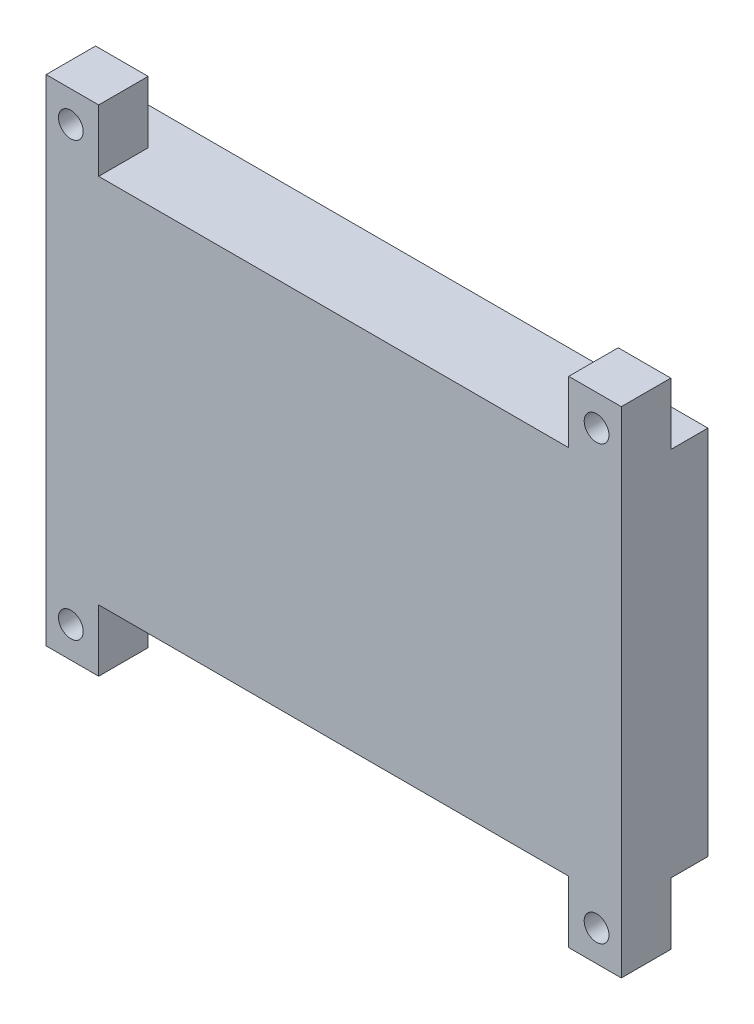
ISO-10303-21;
HEADER;
FILE_DESCRIPTION(('STEP AP214'),'2;1');
FILE_NAME('part.step','',(''),(''),'','','');
FILE_SCHEMA(('AUTOMOTIVE_DESIGN { 1 0 10303 214 1 1 1 1 }'));
ENDSEC;
DATA;
#1=APPLICATION_CONTEXT('core data for automotive mechanical design processes');
#2=APPLICATION_PROTOCOL_DEFINITION('international standard','automotive_design',2000,#1);
#3=PRODUCT_CONTEXT('',#1,'mechanical');
#4=PRODUCT('Part','Part','',(#3));
#5=PRODUCT_RELATED_PRODUCT_CATEGORY('part','',(#4));
#6=PRODUCT_DEFINITION_FORMATION('','',#4);
#7=PRODUCT_DEFINITION_CONTEXT('part definition',#1,'design');
#8=PRODUCT_DEFINITION('design','',#6,#7);
#9=PRODUCT_DEFINITION_SHAPE('','',#8);
#10=(LENGTH_UNIT() NAMED_UNIT(*) SI_UNIT(.MILLI.,.METRE.));
#11=(NAMED_UNIT(*) PLANE_ANGLE_UNIT() SI_UNIT($,.RADIAN.));
#12=(NAMED_UNIT(*) SI_UNIT($,.STERADIAN.) SOLID_ANGLE_UNIT());
#13=UNCERTAINTY_MEASURE_WITH_UNIT(LENGTH_MEASURE(1.E-05),#10,'distance_accuracy_value','');
#14=(GEOMETRIC_REPRESENTATION_CONTEXT(3) GLOBAL_UNCERTAINTY_ASSIGNED_CONTEXT((#13)) GLOBAL_UNIT_ASSIGNED_CONTEXT((#10,
#11,#12)) REPRESENTATION_CONTEXT('',''));
#15=CARTESIAN_POINT('',(0.,0.,0.));
#16=DIRECTION('',(0.,0.,1.));
#17=DIRECTION('',(1.,0.,0.));
#18=AXIS2_PLACEMENT_3D('',#15,#16,#17);
#19=CARTESIAN_POINT('',(0.,0.,6.));
#20=DIRECTION('',(0.,0.,1.));
#21=DIRECTION('',(1.,0.,0.));
#22=AXIS2_PLACEMENT_3D('',#19,#20,#21);
#23=PLANE('',#22);
#24=CARTESIAN_POINT('',(-42.5,35.,6.));
#25=DIRECTION('',(0.,0.,-1.));
#26=DIRECTION('',(1.,0.,0.));
#27=AXIS2_PLACEMENT_3D('',#24,#25,#26);
#28=CIRCLE('',#27,2.);
#29=CARTESIAN_POINT('',(-40.5,35.,6.));
#30=VERTEX_POINT('',#29);
#31=EDGE_CURVE('E343',#30,#30,#28,.T.);
#32=ORIENTED_EDGE('',*,*,#31,.F.);
#33=EDGE_LOOP('',(#32));
#34=FACE_BOUND('',#33,.T.);
#35=DIRECTION('',(-1.,0.,0.));
#36=VECTOR('',#35,1.);
#37=CARTESIAN_POINT('',(-46.5,40.,6.));
#38=LINE('',#37,#36);
#39=CARTESIAN_POINT('',(-38.,40.,6.));
#40=VERTEX_POINT('',#39);
#41=CARTESIAN_POINT('',(-46.5,40.,6.));
#42=VERTEX_POINT('',#41);
#43=EDGE_CURVE('E192',#40,#42,#38,.T.);
#44=ORIENTED_EDGE('',*,*,#43,.F.);
#45=DIRECTION('',(0.,1.,0.));
#46=VECTOR('',#45,1.);
#47=CARTESIAN_POINT('',(-38.,40.,6.));
#48=LINE('',#47,#46);
#49=CARTESIAN_POINT('',(-38.,30.,6.));
#50=VERTEX_POINT('',#49);
#51=EDGE_CURVE('E153',#50,#40,#48,.T.);
#52=ORIENTED_EDGE('',*,*,#51,.F.);
#53=DIRECTION('',(-1.,0.,0.));
#54=VECTOR('',#53,1.);
#55=CARTESIAN_POINT('',(-46.5,30.,6.));
#56=LINE('',#55,#54);
#57=CARTESIAN_POINT('',(-46.5,30.,6.));
#58=VERTEX_POINT('',#57);
#59=EDGE_CURVE('E212',#50,#58,#56,.T.);
#60=ORIENTED_EDGE('',*,*,#59,.T.);
#61=DIRECTION('',(0.,-1.,0.));
#62=VECTOR('',#61,1.);
#63=CARTESIAN_POINT('',(-46.5,40.,6.));
#64=LINE('',#63,#62);
#65=EDGE_CURVE('E180',#42,#58,#64,.T.);
#66=ORIENTED_EDGE('',*,*,#65,.F.);
#67=EDGE_LOOP('',(#44,#52,#60,#66));
#68=FACE_BOUND('',#67,.T.);
#69=ADVANCED_FACE('F35',(#34,#68),#23,.F.);
#70=CARTESIAN_POINT('',(42.5,-35.,6.));
#71=DIRECTION('',(0.,0.,-1.));
#72=DIRECTION('',(1.,0.,0.));
#73=AXIS2_PLACEMENT_3D('',#70,#71,#72);
#74=CIRCLE('',#73,2.);
#75=CARTESIAN_POINT('',(44.5,-35.,6.));
#76=VERTEX_POINT('',#75);
#77=EDGE_CURVE('E346',#76,#76,#74,.T.);
#78=ORIENTED_EDGE('',*,*,#77,.F.);
#79=EDGE_LOOP('',(#78));
#80=FACE_BOUND('',#79,.T.);
#81=DIRECTION('',(1.,0.,0.));
#82=VECTOR('',#81,1.);
#83=CARTESIAN_POINT('',(-46.5,-40.,6.));
#84=LINE('',#83,#82);
#85=CARTESIAN_POINT('',(38.,-40.,6.));
#86=VERTEX_POINT('',#85);
#87=CARTESIAN_POINT('',(46.5,-40.,6.));
#88=VERTEX_POINT('',#87);
#89=EDGE_CURVE('E183',#86,#88,#84,.T.);
#90=ORIENTED_EDGE('',*,*,#89,.F.);
#91=DIRECTION('',(0.,-1.,0.));
#92=VECTOR('',#91,1.);
#93=CARTESIAN_POINT('',(38.,-30.,6.));
#94=LINE('',#93,#92);
#95=CARTESIAN_POINT('',(38.,-30.,6.));
#96=VERTEX_POINT('',#95);
#97=EDGE_CURVE('E253',#96,#86,#94,.T.);
#98=ORIENTED_EDGE('',*,*,#97,.F.);
#99=DIRECTION('',(1.,0.,0.));
#100=VECTOR('',#99,1.);
#101=CARTESIAN_POINT('',(-46.5,-30.,6.));
#102=LINE('',#101,#100);
#103=CARTESIAN_POINT('',(46.5,-30.,6.));
#104=VERTEX_POINT('',#103);
#105=EDGE_CURVE('E211',#96,#104,#102,.T.);
#106=ORIENTED_EDGE('',*,*,#105,.T.);
#107=DIRECTION('',(0.,1.,0.));
#108=VECTOR('',#107,1.);
#109=CARTESIAN_POINT('',(46.5,40.,6.));
#110=LINE('',#109,#108);
#111=EDGE_CURVE('E189',#88,#104,#110,.T.);
#112=ORIENTED_EDGE('',*,*,#111,.F.);
#113=EDGE_LOOP('',(#90,#98,#106,#112));
#114=FACE_BOUND('',#113,.T.);
#115=ADVANCED_FACE('F251',(#80,#114),#23,.F.);
#116=CARTESIAN_POINT('',(-46.5,-40.,14.));
#117=DIRECTION('',(0.,1.,0.));
#118=DIRECTION('',(0.,0.,1.));
#119=AXIS2_PLACEMENT_3D('',#116,#117,#118);
#120=PLANE('',#119);
#121=DIRECTION('',(1.,0.,0.));
#122=VECTOR('',#121,1.);
#123=CARTESIAN_POINT('',(-46.5,-40.,14.));
#124=LINE('',#123,#122);
#125=CARTESIAN_POINT('',(38.,-40.,14.));
#126=VERTEX_POINT('',#125);
#127=CARTESIAN_POINT('',(46.5,-40.,14.));
#128=VERTEX_POINT('',#127);
#129=EDGE_CURVE('E281',#126,#128,#124,.T.);
#130=ORIENTED_EDGE('',*,*,#129,.F.);
#131=DIRECTION('',(0.,0.,-1.));
#132=VECTOR('',#131,1.);
#133=CARTESIAN_POINT('',(38.,-40.,14.));
#134=LINE('',#133,#132);
#135=EDGE_CURVE('E263',#126,#86,#134,.T.);
#136=ORIENTED_EDGE('',*,*,#135,.T.);
#137=ORIENTED_EDGE('',*,*,#89,.T.);
#138=DIRECTION('',(0.,0.,-1.));
#139=VECTOR('',#138,1.);
#140=CARTESIAN_POINT('',(46.5,-40.,14.));
#141=LINE('',#140,#139);
#142=EDGE_CURVE('E201',#128,#88,#141,.T.);
#143=ORIENTED_EDGE('',*,*,#142,.F.);
#144=EDGE_LOOP('',(#130,#136,#137,#143));
#145=FACE_BOUND('',#144,.T.);
#146=ADVANCED_FACE('F284',(#145),#120,.F.);
#147=CARTESIAN_POINT('',(-46.5,40.,14.));
#148=DIRECTION('',(0.,-1.,0.));
#149=DIRECTION('',(0.,0.,-1.));
#150=AXIS2_PLACEMENT_3D('',#147,#148,#149);
#151=PLANE('',#150);
#152=DIRECTION('',(-1.,0.,0.));
#153=VECTOR('',#152,1.);
#154=CARTESIAN_POINT('',(-46.5,40.,14.));
#155=LINE('',#154,#153);
#156=CARTESIAN_POINT('',(-38.,40.,14.));
#157=VERTEX_POINT('',#156);
#158=CARTESIAN_POINT('',(-46.5,40.,14.));
#159=VERTEX_POINT('',#158);
#160=EDGE_CURVE('E162',#157,#159,#155,.T.);
#161=ORIENTED_EDGE('',*,*,#160,.F.);
#162=DIRECTION('',(0.,0.,-1.));
#163=VECTOR('',#162,1.);
#164=CARTESIAN_POINT('',(-38.,40.,14.));
#165=LINE('',#164,#163);
#166=EDGE_CURVE('E148',#157,#40,#165,.T.);
#167=ORIENTED_EDGE('',*,*,#166,.T.);
#168=ORIENTED_EDGE('',*,*,#43,.T.);
#169=DIRECTION('',(0.,0.,-1.));
#170=VECTOR('',#169,1.);
#171=CARTESIAN_POINT('',(-46.5,40.,14.));
#172=LINE('',#171,#170);
#173=EDGE_CURVE('E170',#159,#42,#172,.T.);
#174=ORIENTED_EDGE('',*,*,#173,.F.);
#175=EDGE_LOOP('',(#161,#167,#168,#174));
#176=FACE_BOUND('',#175,.T.);
#177=ADVANCED_FACE('F168',(#176),#151,.F.);
#178=CARTESIAN_POINT('',(46.5,30.,6.));
#179=DIRECTION('',(-1.,0.,0.));
#180=DIRECTION('',(0.,-1.,0.));
#181=AXIS2_PLACEMENT_3D('',#178,#179,#180);
#182=PLANE('',#181);
#183=DIRECTION('',(0.,1.,0.));
#184=VECTOR('',#183,1.);
#185=CARTESIAN_POINT('',(46.5,30.,0.));
#186=LINE('',#185,#184);
#187=CARTESIAN_POINT('',(46.5,-30.,0.));
#188=VERTEX_POINT('',#187);
#189=CARTESIAN_POINT('',(46.5,30.,0.));
#190=VERTEX_POINT('',#189);
#191=EDGE_CURVE('E207',#188,#190,#186,.T.);
#192=ORIENTED_EDGE('',*,*,#191,.T.);
#193=DIRECTION('',(0.,0.,-1.));
#194=VECTOR('',#193,1.);
#195=CARTESIAN_POINT('',(46.5,30.,6.));
#196=LINE('',#195,#194);
#197=CARTESIAN_POINT('',(46.5,30.,6.));
#198=VERTEX_POINT('',#197);
#199=EDGE_CURVE('E11',#198,#190,#196,.T.);
#200=ORIENTED_EDGE('',*,*,#199,.F.);
#201=CARTESIAN_POINT('',(46.5,40.,6.));
#202=VERTEX_POINT('',#201);
#203=EDGE_CURVE('E188',#198,#202,#110,.T.);
#204=ORIENTED_EDGE('',*,*,#203,.T.);
#205=DIRECTION('',(0.,0.,-1.));
#206=VECTOR('',#205,1.);
#207=CARTESIAN_POINT('',(46.5,40.,14.));
#208=LINE('',#207,#206);
#209=CARTESIAN_POINT('',(46.5,40.,14.));
#210=VERTEX_POINT('',#209);
#211=EDGE_CURVE('E198',#210,#202,#208,.T.);
#212=ORIENTED_EDGE('',*,*,#211,.F.);
#213=DIRECTION('',(0.,1.,0.));
#214=VECTOR('',#213,1.);
#215=CARTESIAN_POINT('',(46.5,40.,14.));
#216=LINE('',#215,#214);
#217=EDGE_CURVE('E173',#128,#210,#216,.T.);
#218=ORIENTED_EDGE('',*,*,#217,.F.);
#219=ORIENTED_EDGE('',*,*,#142,.T.);
#220=ORIENTED_EDGE('',*,*,#111,.T.);
#221=DIRECTION('',(0.,0.,-1.));
#222=VECTOR('',#221,1.);
#223=CARTESIAN_POINT('',(46.5,-30.,6.));
#224=LINE('',#223,#222);
#225=EDGE_CURVE('E216',#104,#188,#224,.T.);
#226=ORIENTED_EDGE('',*,*,#225,.T.);
#227=EDGE_LOOP('',(#192,#200,#204,#212,#218,#219,#220,#226));
#228=FACE_BOUND('',#227,.T.);
#229=ADVANCED_FACE('F37',(#228),#182,.F.);
#230=CARTESIAN_POINT('',(-46.5,30.,6.));
#231=DIRECTION('',(0.,-1.,0.));
#232=DIRECTION('',(0.,0.,-1.));
#233=AXIS2_PLACEMENT_3D('',#230,#231,#232);
#234=PLANE('',#233);
#235=DIRECTION('',(-1.,0.,0.));
#236=VECTOR('',#235,1.);
#237=CARTESIAN_POINT('',(-46.5,30.,0.));
#238=LINE('',#237,#236);
#239=CARTESIAN_POINT('',(-46.5,30.,0.));
#240=VERTEX_POINT('',#239);
#241=EDGE_CURVE('E219',#190,#240,#238,.T.);
#242=ORIENTED_EDGE('',*,*,#241,.T.);
#243=DIRECTION('',(0.,0.,-1.));
#244=VECTOR('',#243,1.);
#245=CARTESIAN_POINT('',(-46.5,30.,6.));
#246=LINE('',#245,#244);
#247=EDGE_CURVE('E43',#58,#240,#246,.T.);
#248=ORIENTED_EDGE('',*,*,#247,.F.);
#249=ORIENTED_EDGE('',*,*,#59,.F.);
#250=DIRECTION('',(0.,0.,-1.));
#251=VECTOR('',#250,1.);
#252=CARTESIAN_POINT('',(-38.,30.,14.));
#253=LINE('',#252,#251);
#254=CARTESIAN_POINT('',(-38.,30.,14.));
#255=VERTEX_POINT('',#254);
#256=EDGE_CURVE('E299',#255,#50,#253,.T.);
#257=ORIENTED_EDGE('',*,*,#256,.F.);
#258=DIRECTION('',(-1.,0.,0.));
#259=VECTOR('',#258,1.);
#260=CARTESIAN_POINT('',(-38.,30.,14.));
#261=LINE('',#260,#259);
#262=CARTESIAN_POINT('',(38.,30.,14.));
#263=VERTEX_POINT('',#262);
#264=EDGE_CURVE('E50',#263,#255,#261,.T.);
#265=ORIENTED_EDGE('',*,*,#264,.F.);
#266=DIRECTION('',(0.,0.,-1.));
#267=VECTOR('',#266,1.);
#268=CARTESIAN_POINT('',(38.,30.,14.));
#269=LINE('',#268,#267);
#270=CARTESIAN_POINT('',(38.,30.,6.));
#271=VERTEX_POINT('',#270);
#272=EDGE_CURVE('E301',#263,#271,#269,.T.);
#273=ORIENTED_EDGE('',*,*,#272,.T.);
#274=EDGE_CURVE('E208',#198,#271,#56,.T.);
#275=ORIENTED_EDGE('',*,*,#274,.F.);
#276=ORIENTED_EDGE('',*,*,#199,.T.);
#277=EDGE_LOOP('',(#242,#248,#249,#257,#265,#273,#275,#276));
#278=FACE_BOUND('',#277,.T.);
#279=ADVANCED_FACE('F307',(#278),#234,.F.);
#280=CARTESIAN_POINT('',(-46.5,30.,6.));
#281=DIRECTION('',(1.,0.,0.));
#282=DIRECTION('',(0.,1.,0.));
#283=AXIS2_PLACEMENT_3D('',#280,#281,#282);
#284=PLANE('',#283);
#285=DIRECTION('',(0.,-1.,0.));
#286=VECTOR('',#285,1.);
#287=CARTESIAN_POINT('',(-46.5,30.,0.));
#288=LINE('',#287,#286);
#289=CARTESIAN_POINT('',(-46.5,-30.,0.));
#290=VERTEX_POINT('',#289);
#291=EDGE_CURVE('E221',#240,#290,#288,.T.);
#292=ORIENTED_EDGE('',*,*,#291,.T.);
#293=DIRECTION('',(0.,0.,-1.));
#294=VECTOR('',#293,1.);
#295=CARTESIAN_POINT('',(-46.5,-30.,6.));
#296=LINE('',#295,#294);
#297=CARTESIAN_POINT('',(-46.5,-30.,6.));
#298=VERTEX_POINT('',#297);
#299=EDGE_CURVE('E227',#298,#290,#296,.T.);
#300=ORIENTED_EDGE('',*,*,#299,.F.);
#301=CARTESIAN_POINT('',(-46.5,-40.,6.));
#302=VERTEX_POINT('',#301);
#303=EDGE_CURVE('E184',#298,#302,#64,.T.);
#304=ORIENTED_EDGE('',*,*,#303,.T.);
#305=DIRECTION('',(0.,0.,-1.));
#306=VECTOR('',#305,1.);
#307=CARTESIAN_POINT('',(-46.5,-40.,14.));
#308=LINE('',#307,#306);
#309=CARTESIAN_POINT('',(-46.5,-40.,14.));
#310=VERTEX_POINT('',#309);
#311=EDGE_CURVE('E204',#310,#302,#308,.T.);
#312=ORIENTED_EDGE('',*,*,#311,.F.);
#313=DIRECTION('',(0.,-1.,0.));
#314=VECTOR('',#313,1.);
#315=CARTESIAN_POINT('',(-46.5,40.,14.));
#316=LINE('',#315,#314);
#317=EDGE_CURVE('E196',#159,#310,#316,.T.);
#318=ORIENTED_EDGE('',*,*,#317,.F.);
#319=ORIENTED_EDGE('',*,*,#173,.T.);
#320=ORIENTED_EDGE('',*,*,#65,.T.);
#321=ORIENTED_EDGE('',*,*,#247,.T.);
#322=EDGE_LOOP('',(#292,#300,#304,#312,#318,#319,#320,#321));
#323=FACE_BOUND('',#322,.T.);
#324=ADVANCED_FACE('F233',(#323),#284,.F.);
#325=CARTESIAN_POINT('',(-46.5,-30.,6.));
#326=DIRECTION('',(0.,1.,0.));
#327=DIRECTION('',(0.,0.,1.));
#328=AXIS2_PLACEMENT_3D('',#325,#326,#327);
#329=PLANE('',#328);
#330=DIRECTION('',(1.,0.,0.));
#331=VECTOR('',#330,1.);
#332=CARTESIAN_POINT('',(-46.5,-30.,0.));
#333=LINE('',#332,#331);
#334=EDGE_CURVE('E223',#290,#188,#333,.T.);
#335=ORIENTED_EDGE('',*,*,#334,.T.);
#336=ORIENTED_EDGE('',*,*,#225,.F.);
#337=ORIENTED_EDGE('',*,*,#105,.F.);
#338=DIRECTION('',(0.,0.,-1.));
#339=VECTOR('',#338,1.);
#340=CARTESIAN_POINT('',(38.,-30.,14.));
#341=LINE('',#340,#339);
#342=CARTESIAN_POINT('',(38.,-30.,14.));
#343=VERTEX_POINT('',#342);
#344=EDGE_CURVE('E254',#343,#96,#341,.T.);
#345=ORIENTED_EDGE('',*,*,#344,.F.);
#346=DIRECTION('',(1.,0.,0.));
#347=VECTOR('',#346,1.);
#348=CARTESIAN_POINT('',(38.,-30.,14.));
#349=LINE('',#348,#347);
#350=CARTESIAN_POINT('',(-38.,-30.,14.));
#351=VERTEX_POINT('',#350);
#352=EDGE_CURVE('E58',#351,#343,#349,.T.);
#353=ORIENTED_EDGE('',*,*,#352,.F.);
#354=DIRECTION('',(0.,0.,-1.));
#355=VECTOR('',#354,1.);
#356=CARTESIAN_POINT('',(-38.,-30.,14.));
#357=LINE('',#356,#355);
#358=CARTESIAN_POINT('',(-38.,-30.,6.));
#359=VERTEX_POINT('',#358);
#360=EDGE_CURVE('E257',#351,#359,#357,.T.);
#361=ORIENTED_EDGE('',*,*,#360,.T.);
#362=EDGE_CURVE('E213',#298,#359,#102,.T.);
#363=ORIENTED_EDGE('',*,*,#362,.F.);
#364=ORIENTED_EDGE('',*,*,#299,.T.);
#365=EDGE_LOOP('',(#335,#336,#337,#345,#353,#361,#363,#364));
#366=FACE_BOUND('',#365,.T.);
#367=ADVANCED_FACE('F241',(#366),#329,.F.);
#368=CARTESIAN_POINT('',(0.,0.,0.));
#369=DIRECTION('',(0.,0.,1.));
#370=DIRECTION('',(1.,0.,0.));
#371=AXIS2_PLACEMENT_3D('',#368,#369,#370);
#372=PLANE('',#371);
#373=ORIENTED_EDGE('',*,*,#191,.F.);
#374=ORIENTED_EDGE('',*,*,#334,.F.);
#375=ORIENTED_EDGE('',*,*,#291,.F.);
#376=ORIENTED_EDGE('',*,*,#241,.F.);
#377=EDGE_LOOP('',(#373,#374,#375,#376));
#378=FACE_BOUND('',#377,.T.);
#379=ADVANCED_FACE('F239',(#378),#372,.F.);
#380=CARTESIAN_POINT('',(42.5,35.,6.));
#381=DIRECTION('',(0.,0.,-1.));
#382=DIRECTION('',(-1.,0.,0.));
#383=AXIS2_PLACEMENT_3D('',#380,#381,#382);
#384=CIRCLE('',#383,2.);
#385=CARTESIAN_POINT('',(40.5,35.,6.));
#386=VERTEX_POINT('',#385);
#387=EDGE_CURVE('E337',#386,#386,#384,.T.);
#388=ORIENTED_EDGE('',*,*,#387,.F.);
#389=EDGE_LOOP('',(#388));
#390=FACE_BOUND('',#389,.T.);
#391=ORIENTED_EDGE('',*,*,#274,.T.);
#392=DIRECTION('',(0.,-1.,0.));
#393=VECTOR('',#392,1.);
#394=CARTESIAN_POINT('',(38.,40.,6.));
#395=LINE('',#394,#393);
#396=CARTESIAN_POINT('',(38.,40.,6.));
#397=VERTEX_POINT('',#396);
#398=EDGE_CURVE('E166',#397,#271,#395,.T.);
#399=ORIENTED_EDGE('',*,*,#398,.F.);
#400=EDGE_CURVE('E193',#202,#397,#38,.T.);
#401=ORIENTED_EDGE('',*,*,#400,.F.);
#402=ORIENTED_EDGE('',*,*,#203,.F.);
#403=EDGE_LOOP('',(#391,#399,#401,#402));
#404=FACE_BOUND('',#403,.T.);
#405=ADVANCED_FACE('F306',(#390,#404),#23,.F.);
#406=CARTESIAN_POINT('',(-42.5,-35.,6.));
#407=DIRECTION('',(0.,0.,-1.));
#408=DIRECTION('',(-1.,0.,0.));
#409=AXIS2_PLACEMENT_3D('',#406,#407,#408);
#410=CIRCLE('',#409,2.);
#411=CARTESIAN_POINT('',(-44.5,-35.,6.));
#412=VERTEX_POINT('',#411);
#413=EDGE_CURVE('E352',#412,#412,#410,.T.);
#414=ORIENTED_EDGE('',*,*,#413,.F.);
#415=EDGE_LOOP('',(#414));
#416=FACE_BOUND('',#415,.T.);
#417=ORIENTED_EDGE('',*,*,#362,.T.);
#418=DIRECTION('',(0.,1.,0.));
#419=VECTOR('',#418,1.);
#420=CARTESIAN_POINT('',(-38.,-30.,6.));
#421=LINE('',#420,#419);
#422=CARTESIAN_POINT('',(-38.,-40.,6.));
#423=VERTEX_POINT('',#422);
#424=EDGE_CURVE('E266',#423,#359,#421,.T.);
#425=ORIENTED_EDGE('',*,*,#424,.F.);
#426=EDGE_CURVE('E185',#302,#423,#84,.T.);
#427=ORIENTED_EDGE('',*,*,#426,.F.);
#428=ORIENTED_EDGE('',*,*,#303,.F.);
#429=EDGE_LOOP('',(#417,#425,#427,#428));
#430=FACE_BOUND('',#429,.T.);
#431=ADVANCED_FACE('F321',(#416,#430),#23,.F.);
#432=ORIENTED_EDGE('',*,*,#426,.T.);
#433=DIRECTION('',(0.,0.,-1.));
#434=VECTOR('',#433,1.);
#435=CARTESIAN_POINT('',(-38.,-40.,14.));
#436=LINE('',#435,#434);
#437=CARTESIAN_POINT('',(-38.,-40.,14.));
#438=VERTEX_POINT('',#437);
#439=EDGE_CURVE('E271',#438,#423,#436,.T.);
#440=ORIENTED_EDGE('',*,*,#439,.F.);
#441=EDGE_CURVE('E176',#310,#438,#124,.T.);
#442=ORIENTED_EDGE('',*,*,#441,.F.);
#443=ORIENTED_EDGE('',*,*,#311,.T.);
#444=EDGE_LOOP('',(#432,#440,#442,#443));
#445=FACE_BOUND('',#444,.T.);
#446=ADVANCED_FACE('F332',(#445),#120,.F.);
#447=ORIENTED_EDGE('',*,*,#400,.T.);
#448=DIRECTION('',(0.,0.,-1.));
#449=VECTOR('',#448,1.);
#450=CARTESIAN_POINT('',(38.,40.,14.));
#451=LINE('',#450,#449);
#452=CARTESIAN_POINT('',(38.,40.,14.));
#453=VERTEX_POINT('',#452);
#454=EDGE_CURVE('E157',#453,#397,#451,.T.);
#455=ORIENTED_EDGE('',*,*,#454,.F.);
#456=EDGE_CURVE('E172',#210,#453,#155,.T.);
#457=ORIENTED_EDGE('',*,*,#456,.F.);
#458=ORIENTED_EDGE('',*,*,#211,.T.);
#459=EDGE_LOOP('',(#447,#455,#457,#458));
#460=FACE_BOUND('',#459,.T.);
#461=ADVANCED_FACE('F290',(#460),#151,.F.);
#462=CARTESIAN_POINT('',(0.,0.,14.));
#463=DIRECTION('',(0.,0.,1.));
#464=DIRECTION('',(1.,0.,0.));
#465=AXIS2_PLACEMENT_3D('',#462,#463,#464);
#466=PLANE('',#465);
#467=CARTESIAN_POINT('',(42.5,-35.,14.));
#468=DIRECTION('',(0.,0.,-1.));
#469=DIRECTION('',(1.,0.,0.));
#470=AXIS2_PLACEMENT_3D('',#467,#468,#469);
#471=CIRCLE('',#470,2.);
#472=CARTESIAN_POINT('',(44.5,-35.,14.));
#473=VERTEX_POINT('',#472);
#474=EDGE_CURVE('E349',#473,#473,#471,.T.);
#475=ORIENTED_EDGE('',*,*,#474,.T.);
#476=EDGE_LOOP('',(#475));
#477=FACE_BOUND('',#476,.T.);
#478=CARTESIAN_POINT('',(-42.5,-35.,14.));
#479=DIRECTION('',(0.,0.,-1.));
#480=DIRECTION('',(-1.,0.,0.));
#481=AXIS2_PLACEMENT_3D('',#478,#479,#480);
#482=CIRCLE('',#481,2.);
#483=CARTESIAN_POINT('',(-44.5,-35.,14.));
#484=VERTEX_POINT('',#483);
#485=EDGE_CURVE('E355',#484,#484,#482,.T.);
#486=ORIENTED_EDGE('',*,*,#485,.T.);
#487=EDGE_LOOP('',(#486));
#488=FACE_BOUND('',#487,.T.);
#489=CARTESIAN_POINT('',(-42.5,35.,14.));
#490=DIRECTION('',(0.,0.,-1.));
#491=DIRECTION('',(1.,0.,0.));
#492=AXIS2_PLACEMENT_3D('',#489,#490,#491);
#493=CIRCLE('',#492,2.);
#494=CARTESIAN_POINT('',(-40.5,35.,14.));
#495=VERTEX_POINT('',#494);
#496=EDGE_CURVE('E339',#495,#495,#493,.T.);
#497=ORIENTED_EDGE('',*,*,#496,.T.);
#498=EDGE_LOOP('',(#497));
#499=FACE_BOUND('',#498,.T.);
#500=CARTESIAN_POINT('',(42.5,35.,14.));
#501=DIRECTION('',(0.,0.,-1.));
#502=DIRECTION('',(-1.,0.,0.));
#503=AXIS2_PLACEMENT_3D('',#500,#501,#502);
#504=CIRCLE('',#503,2.);
#505=CARTESIAN_POINT('',(40.5,35.,14.));
#506=VERTEX_POINT('',#505);
#507=EDGE_CURVE('E276',#506,#506,#504,.T.);
#508=ORIENTED_EDGE('',*,*,#507,.T.);
#509=EDGE_LOOP('',(#508));
#510=FACE_BOUND('',#509,.T.);
#511=DIRECTION('',(0.,1.,0.));
#512=VECTOR('',#511,1.);
#513=CARTESIAN_POINT('',(-38.,40.,14.));
#514=LINE('',#513,#512);
#515=EDGE_CURVE('E151',#255,#157,#514,.T.);
#516=ORIENTED_EDGE('',*,*,#515,.T.);
#517=ORIENTED_EDGE('',*,*,#160,.T.);
#518=ORIENTED_EDGE('',*,*,#317,.T.);
#519=ORIENTED_EDGE('',*,*,#441,.T.);
#520=DIRECTION('',(0.,1.,0.));
#521=VECTOR('',#520,1.);
#522=CARTESIAN_POINT('',(-38.,-30.,14.));
#523=LINE('',#522,#521);
#524=EDGE_CURVE('E265',#438,#351,#523,.T.);
#525=ORIENTED_EDGE('',*,*,#524,.T.);
#526=ORIENTED_EDGE('',*,*,#352,.T.);
#527=DIRECTION('',(0.,-1.,0.));
#528=VECTOR('',#527,1.);
#529=CARTESIAN_POINT('',(38.,-30.,14.));
#530=LINE('',#529,#528);
#531=EDGE_CURVE('E260',#343,#126,#530,.T.);
#532=ORIENTED_EDGE('',*,*,#531,.T.);
#533=ORIENTED_EDGE('',*,*,#129,.T.);
#534=ORIENTED_EDGE('',*,*,#217,.T.);
#535=ORIENTED_EDGE('',*,*,#456,.T.);
#536=DIRECTION('',(0.,-1.,0.));
#537=VECTOR('',#536,1.);
#538=CARTESIAN_POINT('',(38.,40.,14.));
#539=LINE('',#538,#537);
#540=EDGE_CURVE('E165',#453,#263,#539,.T.);
#541=ORIENTED_EDGE('',*,*,#540,.T.);
#542=ORIENTED_EDGE('',*,*,#264,.T.);
#543=EDGE_LOOP('',(#516,#517,#518,#519,#525,#526,#532,#533,#534,#535,#541,#542));
#544=FACE_BOUND('',#543,.T.);
#545=ADVANCED_FACE('F160',(#477,#488,#499,#510,#544),#466,.T.);
#546=CARTESIAN_POINT('',(38.,-30.,14.));
#547=DIRECTION('',(1.,0.,0.));
#548=DIRECTION('',(0.,0.,-1.));
#549=AXIS2_PLACEMENT_3D('',#546,#547,#548);
#550=PLANE('',#549);
#551=ORIENTED_EDGE('',*,*,#97,.T.);
#552=ORIENTED_EDGE('',*,*,#135,.F.);
#553=ORIENTED_EDGE('',*,*,#531,.F.);
#554=ORIENTED_EDGE('',*,*,#344,.T.);
#555=EDGE_LOOP('',(#551,#552,#553,#554));
#556=FACE_BOUND('',#555,.T.);
#557=ADVANCED_FACE('F261',(#556),#550,.F.);
#558=CARTESIAN_POINT('',(-38.,-30.,14.));
#559=DIRECTION('',(-1.,0.,0.));
#560=DIRECTION('',(0.,0.,1.));
#561=AXIS2_PLACEMENT_3D('',#558,#559,#560);
#562=PLANE('',#561);
#563=ORIENTED_EDGE('',*,*,#424,.T.);
#564=ORIENTED_EDGE('',*,*,#360,.F.);
#565=ORIENTED_EDGE('',*,*,#524,.F.);
#566=ORIENTED_EDGE('',*,*,#439,.T.);
#567=EDGE_LOOP('',(#563,#564,#565,#566));
#568=FACE_BOUND('',#567,.T.);
#569=ADVANCED_FACE('F384',(#568),#562,.F.);
#570=CARTESIAN_POINT('',(-38.,40.,14.));
#571=DIRECTION('',(-1.,0.,0.));
#572=DIRECTION('',(0.,-1.,0.));
#573=AXIS2_PLACEMENT_3D('',#570,#571,#572);
#574=PLANE('',#573);
#575=ORIENTED_EDGE('',*,*,#51,.T.);
#576=ORIENTED_EDGE('',*,*,#166,.F.);
#577=ORIENTED_EDGE('',*,*,#515,.F.);
#578=ORIENTED_EDGE('',*,*,#256,.T.);
#579=EDGE_LOOP('',(#575,#576,#577,#578));
#580=FACE_BOUND('',#579,.T.);
#581=ADVANCED_FACE('F150',(#580),#574,.F.);
#582=CARTESIAN_POINT('',(38.,40.,14.));
#583=DIRECTION('',(1.,0.,0.));
#584=DIRECTION('',(0.,1.,0.));
#585=AXIS2_PLACEMENT_3D('',#582,#583,#584);
#586=PLANE('',#585);
#587=ORIENTED_EDGE('',*,*,#398,.T.);
#588=ORIENTED_EDGE('',*,*,#272,.F.);
#589=ORIENTED_EDGE('',*,*,#540,.F.);
#590=ORIENTED_EDGE('',*,*,#454,.T.);
#591=EDGE_LOOP('',(#587,#588,#589,#590));
#592=FACE_BOUND('',#591,.T.);
#593=ADVANCED_FACE('F304',(#592),#586,.F.);
#594=CARTESIAN_POINT('',(42.5,35.,14.));
#595=DIRECTION('',(0.,0.,-1.));
#596=DIRECTION('',(-1.,0.,0.));
#597=AXIS2_PLACEMENT_3D('',#594,#595,#596);
#598=CYLINDRICAL_SURFACE('',#597,2.);
#599=ORIENTED_EDGE('',*,*,#507,.F.);
#600=EDGE_LOOP('',(#599));
#601=FACE_BOUND('',#600,.T.);
#602=ORIENTED_EDGE('',*,*,#387,.T.);
#603=EDGE_LOOP('',(#602));
#604=FACE_BOUND('',#603,.T.);
#605=ADVANCED_FACE('F363',(#601,#604),#598,.F.);
#606=CARTESIAN_POINT('',(-42.5,35.,14.));
#607=DIRECTION('',(0.,0.,-1.));
#608=DIRECTION('',(-1.,0.,0.));
#609=AXIS2_PLACEMENT_3D('',#606,#607,#608);
#610=CYLINDRICAL_SURFACE('',#609,2.);
#611=ORIENTED_EDGE('',*,*,#496,.F.);
#612=EDGE_LOOP('',(#611));
#613=FACE_BOUND('',#612,.T.);
#614=ORIENTED_EDGE('',*,*,#31,.T.);
#615=EDGE_LOOP('',(#614));
#616=FACE_BOUND('',#615,.T.);
#617=ADVANCED_FACE('F360',(#613,#616),#610,.F.);
#618=CARTESIAN_POINT('',(-42.5,-35.,14.));
#619=DIRECTION('',(0.,0.,-1.));
#620=DIRECTION('',(-1.,0.,0.));
#621=AXIS2_PLACEMENT_3D('',#618,#619,#620);
#622=CYLINDRICAL_SURFACE('',#621,2.);
#623=ORIENTED_EDGE('',*,*,#485,.F.);
#624=EDGE_LOOP('',(#623));
#625=FACE_BOUND('',#624,.T.);
#626=ORIENTED_EDGE('',*,*,#413,.T.);
#627=EDGE_LOOP('',(#626));
#628=FACE_BOUND('',#627,.T.);
#629=ADVANCED_FACE('F362',(#625,#628),#622,.F.);
#630=CARTESIAN_POINT('',(42.5,-35.,14.));
#631=DIRECTION('',(0.,0.,-1.));
#632=DIRECTION('',(-1.,0.,0.));
#633=AXIS2_PLACEMENT_3D('',#630,#631,#632);
#634=CYLINDRICAL_SURFACE('',#633,2.);
#635=ORIENTED_EDGE('',*,*,#474,.F.);
#636=EDGE_LOOP('',(#635));
#637=FACE_BOUND('',#636,.T.);
#638=ORIENTED_EDGE('',*,*,#77,.T.);
#639=EDGE_LOOP('',(#638));
#640=FACE_BOUND('',#639,.T.);
#641=ADVANCED_FACE('F370',(#637,#640),#634,.F.);
#642=CLOSED_SHELL('',(#69,#115,#146,#177,#229,#279,#324,#367,#379,#405,#431,#446,#461,#545,#557,
#569,#581,#593,#605,#617,#629,#641));
#643=MANIFOLD_SOLID_BREP('B2',#642);
#644=ADVANCED_BREP_SHAPE_REPRESENTATION('',(#18,#643),#14);
#645=SHAPE_DEFINITION_REPRESENTATION(#9,#644);
ENDSEC;
END-ISO-10303-21;
